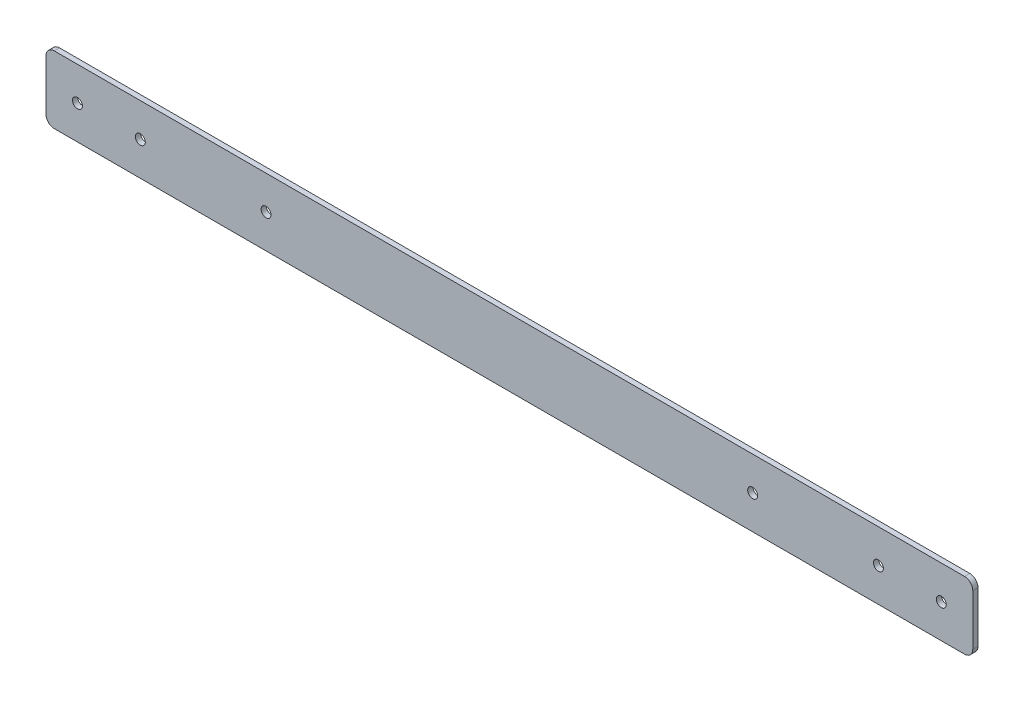
ISO-10303-21;
HEADER;
FILE_DESCRIPTION(('STEP AP214'),'2;1');
FILE_NAME('part.step','',(''),(''),'','','');
FILE_SCHEMA(('AUTOMOTIVE_DESIGN { 1 0 10303 214 1 1 1 1 }'));
ENDSEC;
DATA;
#1=APPLICATION_CONTEXT('core data for automotive mechanical design processes');
#2=APPLICATION_PROTOCOL_DEFINITION('international standard','automotive_design',2000,#1);
#3=PRODUCT_CONTEXT('',#1,'mechanical');
#4=PRODUCT('Part','Part','',(#3));
#5=PRODUCT_RELATED_PRODUCT_CATEGORY('part','',(#4));
#6=PRODUCT_DEFINITION_FORMATION('','',#4);
#7=PRODUCT_DEFINITION_CONTEXT('part definition',#1,'design');
#8=PRODUCT_DEFINITION('design','',#6,#7);
#9=PRODUCT_DEFINITION_SHAPE('','',#8);
#10=(LENGTH_UNIT() NAMED_UNIT(*) SI_UNIT(.MILLI.,.METRE.));
#11=(NAMED_UNIT(*) PLANE_ANGLE_UNIT() SI_UNIT($,.RADIAN.));
#12=(NAMED_UNIT(*) SI_UNIT($,.STERADIAN.) SOLID_ANGLE_UNIT());
#13=UNCERTAINTY_MEASURE_WITH_UNIT(LENGTH_MEASURE(1.E-05),#10,'distance_accuracy_value','');
#14=(GEOMETRIC_REPRESENTATION_CONTEXT(3) GLOBAL_UNCERTAINTY_ASSIGNED_CONTEXT((#13)) GLOBAL_UNIT_ASSIGNED_CONTEXT((#10,
#11,#12)) REPRESENTATION_CONTEXT('',''));
#15=CARTESIAN_POINT('',(0.,0.,0.));
#16=DIRECTION('',(0.,0.,1.));
#17=DIRECTION('',(1.,0.,0.));
#18=AXIS2_PLACEMENT_3D('',#15,#16,#17);
#19=CARTESIAN_POINT('',(1113.,71.6,6.35));
#20=DIRECTION('',(0.,0.,-1.));
#21=DIRECTION('',(-1.,0.,0.));
#22=AXIS2_PLACEMENT_3D('',#19,#20,#21);
#23=PLANE('',#22);
#24=CARTESIAN_POINT('',(1113.,71.6,6.35));
#25=DIRECTION('',(0.,0.,1.));
#26=DIRECTION('',(-1.,0.,0.));
#27=AXIS2_PLACEMENT_3D('',#24,#25,#26);
#28=CIRCLE('',#27,10.);
#29=CARTESIAN_POINT('',(1123.,71.5999999999999,6.35));
#30=VERTEX_POINT('',#29);
#31=CARTESIAN_POINT('',(1113.,81.6,6.35));
#32=VERTEX_POINT('',#31);
#33=EDGE_CURVE('E148',#30,#32,#28,.T.);
#34=ORIENTED_EDGE('',*,*,#33,.T.);
#35=DIRECTION('',(-1.,0.,0.));
#36=VECTOR('',#35,1.);
#37=CARTESIAN_POINT('',(10.0000000000001,81.6,6.35));
#38=LINE('',#37,#36);
#39=CARTESIAN_POINT('',(10.0000000000001,81.6,6.35));
#40=VERTEX_POINT('',#39);
#41=EDGE_CURVE('E96',#32,#40,#38,.T.);
#42=ORIENTED_EDGE('',*,*,#41,.T.);
#43=CARTESIAN_POINT('',(10.,71.6,6.35));
#44=DIRECTION('',(0.,0.,1.));
#45=DIRECTION('',(-1.,0.,0.));
#46=AXIS2_PLACEMENT_3D('',#43,#44,#45);
#47=CIRCLE('',#46,10.);
#48=CARTESIAN_POINT('',(0.,71.5999999999999,6.35));
#49=VERTEX_POINT('',#48);
#50=EDGE_CURVE('E163',#40,#49,#47,.T.);
#51=ORIENTED_EDGE('',*,*,#50,.T.);
#52=DIRECTION('',(0.,-1.,0.));
#53=VECTOR('',#52,1.);
#54=CARTESIAN_POINT('',(0.,10.0000000000001,6.35));
#55=LINE('',#54,#53);
#56=CARTESIAN_POINT('',(0.,10.0000000000001,6.35));
#57=VERTEX_POINT('',#56);
#58=EDGE_CURVE('E176',#49,#57,#55,.T.);
#59=ORIENTED_EDGE('',*,*,#58,.T.);
#60=CARTESIAN_POINT('',(10.,10.,6.35));
#61=DIRECTION('',(0.,0.,1.));
#62=DIRECTION('',(-1.,0.,0.));
#63=AXIS2_PLACEMENT_3D('',#60,#61,#62);
#64=CIRCLE('',#63,10.);
#65=CARTESIAN_POINT('',(10.0000000000001,0.,6.35));
#66=VERTEX_POINT('',#65);
#67=EDGE_CURVE('E115',#57,#66,#64,.T.);
#68=ORIENTED_EDGE('',*,*,#67,.T.);
#69=DIRECTION('',(1.,0.,0.));
#70=VECTOR('',#69,1.);
#71=CARTESIAN_POINT('',(10.0000000000001,0.,6.35));
#72=LINE('',#71,#70);
#73=CARTESIAN_POINT('',(1113.,0.,6.35));
#74=VERTEX_POINT('',#73);
#75=EDGE_CURVE('E109',#66,#74,#72,.T.);
#76=ORIENTED_EDGE('',*,*,#75,.T.);
#77=CARTESIAN_POINT('',(1113.,10.,6.35));
#78=DIRECTION('',(0.,0.,1.));
#79=DIRECTION('',(1.,0.,0.));
#80=AXIS2_PLACEMENT_3D('',#77,#78,#79);
#81=CIRCLE('',#80,10.);
#82=CARTESIAN_POINT('',(1123.,10.,6.35));
#83=VERTEX_POINT('',#82);
#84=EDGE_CURVE('E113',#74,#83,#81,.T.);
#85=ORIENTED_EDGE('',*,*,#84,.T.);
#86=DIRECTION('',(0.,1.,0.));
#87=VECTOR('',#86,1.);
#88=CARTESIAN_POINT('',(1123.,10.0000000000001,6.35));
#89=LINE('',#88,#87);
#90=EDGE_CURVE('E53',#83,#30,#89,.T.);
#91=ORIENTED_EDGE('',*,*,#90,.T.);
#92=EDGE_LOOP('',(#34,#42,#51,#59,#68,#76,#85,#91));
#93=FACE_BOUND('',#92,.T.);
#94=CARTESIAN_POINT('',(38.1,40.8,6.35));
#95=DIRECTION('',(0.,0.,1.));
#96=DIRECTION('',(1.,0.,0.));
#97=AXIS2_PLACEMENT_3D('',#94,#95,#96);
#98=CIRCLE('',#97,5.99999999999999);
#99=CARTESIAN_POINT('',(44.1,40.8,6.35));
#100=VERTEX_POINT('',#99);
#101=EDGE_CURVE('E137',#100,#100,#98,.T.);
#102=ORIENTED_EDGE('',*,*,#101,.F.);
#103=EDGE_LOOP('',(#102));
#104=FACE_BOUND('',#103,.T.);
#105=CARTESIAN_POINT('',(114.3,40.8,6.35));
#106=DIRECTION('',(0.,0.,1.));
#107=DIRECTION('',(1.,0.,0.));
#108=AXIS2_PLACEMENT_3D('',#105,#106,#107);
#109=CIRCLE('',#108,6.);
#110=CARTESIAN_POINT('',(120.3,40.8,6.35));
#111=VERTEX_POINT('',#110);
#112=EDGE_CURVE('E185',#111,#111,#109,.T.);
#113=ORIENTED_EDGE('',*,*,#112,.F.);
#114=EDGE_LOOP('',(#113));
#115=FACE_BOUND('',#114,.T.);
#116=CARTESIAN_POINT('',(266.7,40.8,6.35));
#117=DIRECTION('',(0.,0.,1.));
#118=DIRECTION('',(1.,0.,0.));
#119=AXIS2_PLACEMENT_3D('',#116,#117,#118);
#120=CIRCLE('',#119,5.99999999999999);
#121=CARTESIAN_POINT('',(272.7,40.8,6.35));
#122=VERTEX_POINT('',#121);
#123=EDGE_CURVE('E191',#122,#122,#120,.T.);
#124=ORIENTED_EDGE('',*,*,#123,.F.);
#125=EDGE_LOOP('',(#124));
#126=FACE_BOUND('',#125,.T.);
#127=CARTESIAN_POINT('',(856.3,40.8,6.35));
#128=DIRECTION('',(0.,0.,1.));
#129=DIRECTION('',(-1.,0.,0.));
#130=AXIS2_PLACEMENT_3D('',#127,#128,#129);
#131=CIRCLE('',#130,6.0000000000001);
#132=CARTESIAN_POINT('',(850.3,40.8,6.35));
#133=VERTEX_POINT('',#132);
#134=EDGE_CURVE('E197',#133,#133,#131,.T.);
#135=ORIENTED_EDGE('',*,*,#134,.F.);
#136=EDGE_LOOP('',(#135));
#137=FACE_BOUND('',#136,.T.);
#138=CARTESIAN_POINT('',(1008.7,40.8,6.35));
#139=DIRECTION('',(0.,0.,1.));
#140=DIRECTION('',(-1.,0.,0.));
#141=AXIS2_PLACEMENT_3D('',#138,#139,#140);
#142=CIRCLE('',#141,5.99999999999988);
#143=CARTESIAN_POINT('',(1002.7,40.8,6.35));
#144=VERTEX_POINT('',#143);
#145=EDGE_CURVE('E203',#144,#144,#142,.T.);
#146=ORIENTED_EDGE('',*,*,#145,.F.);
#147=EDGE_LOOP('',(#146));
#148=FACE_BOUND('',#147,.T.);
#149=CARTESIAN_POINT('',(1084.9,40.8,6.35));
#150=DIRECTION('',(0.,0.,1.));
#151=DIRECTION('',(-1.,0.,0.));
#152=AXIS2_PLACEMENT_3D('',#149,#150,#151);
#153=CIRCLE('',#152,6.0000000000001);
#154=CARTESIAN_POINT('',(1078.9,40.8,6.35));
#155=VERTEX_POINT('',#154);
#156=EDGE_CURVE('E209',#155,#155,#153,.T.);
#157=ORIENTED_EDGE('',*,*,#156,.F.);
#158=EDGE_LOOP('',(#157));
#159=FACE_BOUND('',#158,.T.);
#160=ADVANCED_FACE('F36',(#93,#104,#115,#126,#137,#148,#159),#23,.F.);
#161=CARTESIAN_POINT('',(1113.,71.6,0.));
#162=DIRECTION('',(0.,0.,-1.));
#163=DIRECTION('',(-1.,0.,0.));
#164=AXIS2_PLACEMENT_3D('',#161,#162,#163);
#165=PLANE('',#164);
#166=CARTESIAN_POINT('',(1008.7,40.8,0.));
#167=DIRECTION('',(0.,0.,1.));
#168=DIRECTION('',(-1.,0.,0.));
#169=AXIS2_PLACEMENT_3D('',#166,#167,#168);
#170=CIRCLE('',#169,5.99999999999988);
#171=CARTESIAN_POINT('',(1002.7,40.8,0.));
#172=VERTEX_POINT('',#171);
#173=EDGE_CURVE('E206',#172,#172,#170,.T.);
#174=ORIENTED_EDGE('',*,*,#173,.T.);
#175=EDGE_LOOP('',(#174));
#176=FACE_BOUND('',#175,.T.);
#177=CARTESIAN_POINT('',(266.7,40.8,0.));
#178=DIRECTION('',(0.,0.,1.));
#179=DIRECTION('',(1.,0.,0.));
#180=AXIS2_PLACEMENT_3D('',#177,#178,#179);
#181=CIRCLE('',#180,5.99999999999999);
#182=CARTESIAN_POINT('',(272.7,40.8,0.));
#183=VERTEX_POINT('',#182);
#184=EDGE_CURVE('E194',#183,#183,#181,.T.);
#185=ORIENTED_EDGE('',*,*,#184,.T.);
#186=EDGE_LOOP('',(#185));
#187=FACE_BOUND('',#186,.T.);
#188=CARTESIAN_POINT('',(38.1,40.8,0.));
#189=DIRECTION('',(0.,0.,1.));
#190=DIRECTION('',(1.,0.,0.));
#191=AXIS2_PLACEMENT_3D('',#188,#189,#190);
#192=CIRCLE('',#191,5.99999999999999);
#193=CARTESIAN_POINT('',(44.1,40.8,0.));
#194=VERTEX_POINT('',#193);
#195=EDGE_CURVE('E182',#194,#194,#192,.T.);
#196=ORIENTED_EDGE('',*,*,#195,.T.);
#197=EDGE_LOOP('',(#196));
#198=FACE_BOUND('',#197,.T.);
#199=CARTESIAN_POINT('',(1113.,71.6,0.));
#200=DIRECTION('',(0.,0.,1.));
#201=DIRECTION('',(-1.,0.,0.));
#202=AXIS2_PLACEMENT_3D('',#199,#200,#201);
#203=CIRCLE('',#202,10.);
#204=CARTESIAN_POINT('',(1123.,71.5999999999999,0.));
#205=VERTEX_POINT('',#204);
#206=CARTESIAN_POINT('',(1113.,81.6,0.));
#207=VERTEX_POINT('',#206);
#208=EDGE_CURVE('E133',#205,#207,#203,.T.);
#209=ORIENTED_EDGE('',*,*,#208,.F.);
#210=DIRECTION('',(0.,1.,0.));
#211=VECTOR('',#210,1.);
#212=CARTESIAN_POINT('',(1123.,10.0000000000001,0.));
#213=LINE('',#212,#211);
#214=CARTESIAN_POINT('',(1123.,10.,0.));
#215=VERTEX_POINT('',#214);
#216=EDGE_CURVE('E88',#215,#205,#213,.T.);
#217=ORIENTED_EDGE('',*,*,#216,.F.);
#218=CARTESIAN_POINT('',(1113.,10.,0.));
#219=DIRECTION('',(0.,0.,1.));
#220=DIRECTION('',(1.,0.,0.));
#221=AXIS2_PLACEMENT_3D('',#218,#219,#220);
#222=CIRCLE('',#221,10.);
#223=CARTESIAN_POINT('',(1113.,0.,0.));
#224=VERTEX_POINT('',#223);
#225=EDGE_CURVE('E82',#224,#215,#222,.T.);
#226=ORIENTED_EDGE('',*,*,#225,.F.);
#227=DIRECTION('',(1.,0.,0.));
#228=VECTOR('',#227,1.);
#229=CARTESIAN_POINT('',(10.0000000000001,0.,0.));
#230=LINE('',#229,#228);
#231=CARTESIAN_POINT('',(10.0000000000001,0.,0.));
#232=VERTEX_POINT('',#231);
#233=EDGE_CURVE('E123',#232,#224,#230,.T.);
#234=ORIENTED_EDGE('',*,*,#233,.F.);
#235=CARTESIAN_POINT('',(10.,10.,0.));
#236=DIRECTION('',(0.,0.,1.));
#237=DIRECTION('',(-1.,0.,0.));
#238=AXIS2_PLACEMENT_3D('',#235,#236,#237);
#239=CIRCLE('',#238,10.);
#240=CARTESIAN_POINT('',(0.,10.0000000000001,0.));
#241=VERTEX_POINT('',#240);
#242=EDGE_CURVE('E143',#241,#232,#239,.T.);
#243=ORIENTED_EDGE('',*,*,#242,.F.);
#244=DIRECTION('',(0.,-1.,0.));
#245=VECTOR('',#244,1.);
#246=CARTESIAN_POINT('',(0.,10.0000000000001,0.));
#247=LINE('',#246,#245);
#248=CARTESIAN_POINT('',(0.,71.5999999999999,0.));
#249=VERTEX_POINT('',#248);
#250=EDGE_CURVE('E141',#249,#241,#247,.T.);
#251=ORIENTED_EDGE('',*,*,#250,.F.);
#252=CARTESIAN_POINT('',(10.,71.6,0.));
#253=DIRECTION('',(0.,0.,1.));
#254=DIRECTION('',(-1.,0.,0.));
#255=AXIS2_PLACEMENT_3D('',#252,#253,#254);
#256=CIRCLE('',#255,10.);
#257=CARTESIAN_POINT('',(10.0000000000001,81.6,0.));
#258=VERTEX_POINT('',#257);
#259=EDGE_CURVE('E139',#258,#249,#256,.T.);
#260=ORIENTED_EDGE('',*,*,#259,.F.);
#261=DIRECTION('',(-1.,0.,0.));
#262=VECTOR('',#261,1.);
#263=CARTESIAN_POINT('',(10.0000000000001,81.6,0.));
#264=LINE('',#263,#262);
#265=EDGE_CURVE('E136',#207,#258,#264,.T.);
#266=ORIENTED_EDGE('',*,*,#265,.F.);
#267=EDGE_LOOP('',(#209,#217,#226,#234,#243,#251,#260,#266));
#268=FACE_BOUND('',#267,.T.);
#269=CARTESIAN_POINT('',(114.3,40.8,0.));
#270=DIRECTION('',(0.,0.,1.));
#271=DIRECTION('',(1.,0.,0.));
#272=AXIS2_PLACEMENT_3D('',#269,#270,#271);
#273=CIRCLE('',#272,6.);
#274=CARTESIAN_POINT('',(120.3,40.8,0.));
#275=VERTEX_POINT('',#274);
#276=EDGE_CURVE('E188',#275,#275,#273,.T.);
#277=ORIENTED_EDGE('',*,*,#276,.T.);
#278=EDGE_LOOP('',(#277));
#279=FACE_BOUND('',#278,.T.);
#280=CARTESIAN_POINT('',(856.3,40.8,0.));
#281=DIRECTION('',(0.,0.,1.));
#282=DIRECTION('',(-1.,0.,0.));
#283=AXIS2_PLACEMENT_3D('',#280,#281,#282);
#284=CIRCLE('',#283,6.0000000000001);
#285=CARTESIAN_POINT('',(850.3,40.8,0.));
#286=VERTEX_POINT('',#285);
#287=EDGE_CURVE('E200',#286,#286,#284,.T.);
#288=ORIENTED_EDGE('',*,*,#287,.T.);
#289=EDGE_LOOP('',(#288));
#290=FACE_BOUND('',#289,.T.);
#291=CARTESIAN_POINT('',(1084.9,40.8,0.));
#292=DIRECTION('',(0.,0.,1.));
#293=DIRECTION('',(-1.,0.,0.));
#294=AXIS2_PLACEMENT_3D('',#291,#292,#293);
#295=CIRCLE('',#294,6.0000000000001);
#296=CARTESIAN_POINT('',(1078.9,40.8,0.));
#297=VERTEX_POINT('',#296);
#298=EDGE_CURVE('E212',#297,#297,#295,.T.);
#299=ORIENTED_EDGE('',*,*,#298,.T.);
#300=EDGE_LOOP('',(#299));
#301=FACE_BOUND('',#300,.T.);
#302=ADVANCED_FACE('F167',(#176,#187,#198,#268,#279,#290,#301),#165,.T.);
#303=CARTESIAN_POINT('',(1113.,71.6,6.35));
#304=DIRECTION('',(0.,0.,-1.));
#305=DIRECTION('',(-1.,0.,0.));
#306=AXIS2_PLACEMENT_3D('',#303,#304,#305);
#307=CYLINDRICAL_SURFACE('',#306,10.);
#308=ORIENTED_EDGE('',*,*,#208,.T.);
#309=DIRECTION('',(0.,0.,-1.));
#310=VECTOR('',#309,1.);
#311=CARTESIAN_POINT('',(1113.,81.6,6.35));
#312=LINE('',#311,#310);
#313=EDGE_CURVE('E11',#32,#207,#312,.T.);
#314=ORIENTED_EDGE('',*,*,#313,.F.);
#315=ORIENTED_EDGE('',*,*,#33,.F.);
#316=DIRECTION('',(0.,0.,-1.));
#317=VECTOR('',#316,1.);
#318=CARTESIAN_POINT('',(1123.,71.5999999999999,6.35));
#319=LINE('',#318,#317);
#320=EDGE_CURVE('E129',#30,#205,#319,.T.);
#321=ORIENTED_EDGE('',*,*,#320,.T.);
#322=EDGE_LOOP('',(#308,#314,#315,#321));
#323=FACE_BOUND('',#322,.T.);
#324=ADVANCED_FACE('F38',(#323),#307,.T.);
#325=CARTESIAN_POINT('',(10.0000000000001,81.6,6.35));
#326=DIRECTION('',(0.,-1.,0.));
#327=DIRECTION('',(0.,0.,-1.));
#328=AXIS2_PLACEMENT_3D('',#325,#326,#327);
#329=PLANE('',#328);
#330=ORIENTED_EDGE('',*,*,#265,.T.);
#331=DIRECTION('',(0.,0.,-1.));
#332=VECTOR('',#331,1.);
#333=CARTESIAN_POINT('',(10.0000000000001,81.6,6.35));
#334=LINE('',#333,#332);
#335=EDGE_CURVE('E45',#40,#258,#334,.T.);
#336=ORIENTED_EDGE('',*,*,#335,.F.);
#337=ORIENTED_EDGE('',*,*,#41,.F.);
#338=ORIENTED_EDGE('',*,*,#313,.T.);
#339=EDGE_LOOP('',(#330,#336,#337,#338));
#340=FACE_BOUND('',#339,.T.);
#341=ADVANCED_FACE('F244',(#340),#329,.F.);
#342=CARTESIAN_POINT('',(10.,71.6,6.35));
#343=DIRECTION('',(0.,0.,-1.));
#344=DIRECTION('',(-1.,0.,0.));
#345=AXIS2_PLACEMENT_3D('',#342,#343,#344);
#346=CYLINDRICAL_SURFACE('',#345,10.);
#347=ORIENTED_EDGE('',*,*,#259,.T.);
#348=DIRECTION('',(0.,0.,-1.));
#349=VECTOR('',#348,1.);
#350=CARTESIAN_POINT('',(0.,71.5999999999999,6.35));
#351=LINE('',#350,#349);
#352=EDGE_CURVE('E155',#49,#249,#351,.T.);
#353=ORIENTED_EDGE('',*,*,#352,.F.);
#354=ORIENTED_EDGE('',*,*,#50,.F.);
#355=ORIENTED_EDGE('',*,*,#335,.T.);
#356=EDGE_LOOP('',(#347,#353,#354,#355));
#357=FACE_BOUND('',#356,.T.);
#358=ADVANCED_FACE('F161',(#357),#346,.T.);
#359=CARTESIAN_POINT('',(0.,10.0000000000001,6.35));
#360=DIRECTION('',(1.,0.,0.));
#361=DIRECTION('',(0.,0.,-1.));
#362=AXIS2_PLACEMENT_3D('',#359,#360,#361);
#363=PLANE('',#362);
#364=ORIENTED_EDGE('',*,*,#250,.T.);
#365=DIRECTION('',(0.,0.,-1.));
#366=VECTOR('',#365,1.);
#367=CARTESIAN_POINT('',(0.,10.0000000000001,6.35));
#368=LINE('',#367,#366);
#369=EDGE_CURVE('E152',#57,#241,#368,.T.);
#370=ORIENTED_EDGE('',*,*,#369,.F.);
#371=ORIENTED_EDGE('',*,*,#58,.F.);
#372=ORIENTED_EDGE('',*,*,#352,.T.);
#373=EDGE_LOOP('',(#364,#370,#371,#372));
#374=FACE_BOUND('',#373,.T.);
#375=ADVANCED_FACE('F172',(#374),#363,.F.);
#376=CARTESIAN_POINT('',(10.,10.,6.35));
#377=DIRECTION('',(0.,0.,-1.));
#378=DIRECTION('',(-1.,0.,0.));
#379=AXIS2_PLACEMENT_3D('',#376,#377,#378);
#380=CYLINDRICAL_SURFACE('',#379,10.);
#381=ORIENTED_EDGE('',*,*,#242,.T.);
#382=DIRECTION('',(0.,0.,-1.));
#383=VECTOR('',#382,1.);
#384=CARTESIAN_POINT('',(10.0000000000001,0.,6.35));
#385=LINE('',#384,#383);
#386=EDGE_CURVE('E124',#66,#232,#385,.T.);
#387=ORIENTED_EDGE('',*,*,#386,.F.);
#388=ORIENTED_EDGE('',*,*,#67,.F.);
#389=ORIENTED_EDGE('',*,*,#369,.T.);
#390=EDGE_LOOP('',(#381,#387,#388,#389));
#391=FACE_BOUND('',#390,.T.);
#392=ADVANCED_FACE('F175',(#391),#380,.T.);
#393=CARTESIAN_POINT('',(10.0000000000001,0.,6.35));
#394=DIRECTION('',(0.,1.,0.));
#395=DIRECTION('',(0.,0.,1.));
#396=AXIS2_PLACEMENT_3D('',#393,#394,#395);
#397=PLANE('',#396);
#398=ORIENTED_EDGE('',*,*,#233,.T.);
#399=DIRECTION('',(0.,0.,-1.));
#400=VECTOR('',#399,1.);
#401=CARTESIAN_POINT('',(1113.,0.,6.35));
#402=LINE('',#401,#400);
#403=EDGE_CURVE('E120',#74,#224,#402,.T.);
#404=ORIENTED_EDGE('',*,*,#403,.F.);
#405=ORIENTED_EDGE('',*,*,#75,.F.);
#406=ORIENTED_EDGE('',*,*,#386,.T.);
#407=EDGE_LOOP('',(#398,#404,#405,#406));
#408=FACE_BOUND('',#407,.T.);
#409=ADVANCED_FACE('F121',(#408),#397,.F.);
#410=CARTESIAN_POINT('',(1113.,10.,6.35));
#411=DIRECTION('',(0.,0.,-1.));
#412=DIRECTION('',(-1.,0.,0.));
#413=AXIS2_PLACEMENT_3D('',#410,#411,#412);
#414=CYLINDRICAL_SURFACE('',#413,10.);
#415=ORIENTED_EDGE('',*,*,#225,.T.);
#416=DIRECTION('',(0.,0.,-1.));
#417=VECTOR('',#416,1.);
#418=CARTESIAN_POINT('',(1123.,10.,6.35));
#419=LINE('',#418,#417);
#420=EDGE_CURVE('E125',#83,#215,#419,.T.);
#421=ORIENTED_EDGE('',*,*,#420,.F.);
#422=ORIENTED_EDGE('',*,*,#84,.F.);
#423=ORIENTED_EDGE('',*,*,#403,.T.);
#424=EDGE_LOOP('',(#415,#421,#422,#423));
#425=FACE_BOUND('',#424,.T.);
#426=ADVANCED_FACE('F127',(#425),#414,.T.);
#427=CARTESIAN_POINT('',(1123.,10.0000000000001,6.35));
#428=DIRECTION('',(-1.,0.,0.));
#429=DIRECTION('',(0.,0.,1.));
#430=AXIS2_PLACEMENT_3D('',#427,#428,#429);
#431=PLANE('',#430);
#432=ORIENTED_EDGE('',*,*,#216,.T.);
#433=ORIENTED_EDGE('',*,*,#320,.F.);
#434=ORIENTED_EDGE('',*,*,#90,.F.);
#435=ORIENTED_EDGE('',*,*,#420,.T.);
#436=EDGE_LOOP('',(#432,#433,#434,#435));
#437=FACE_BOUND('',#436,.T.);
#438=ADVANCED_FACE('F232',(#437),#431,.F.);
#439=CARTESIAN_POINT('',(38.1,40.8,6.35));
#440=DIRECTION('',(0.,0.,-1.));
#441=DIRECTION('',(-1.,0.,0.));
#442=AXIS2_PLACEMENT_3D('',#439,#440,#441);
#443=CYLINDRICAL_SURFACE('',#442,5.99999999999999);
#444=ORIENTED_EDGE('',*,*,#101,.T.);
#445=EDGE_LOOP('',(#444));
#446=FACE_BOUND('',#445,.T.);
#447=ORIENTED_EDGE('',*,*,#195,.F.);
#448=EDGE_LOOP('',(#447));
#449=FACE_BOUND('',#448,.T.);
#450=ADVANCED_FACE('F229',(#446,#449),#443,.F.);
#451=CARTESIAN_POINT('',(114.3,40.8,6.35));
#452=DIRECTION('',(0.,0.,-1.));
#453=DIRECTION('',(-1.,0.,0.));
#454=AXIS2_PLACEMENT_3D('',#451,#452,#453);
#455=CYLINDRICAL_SURFACE('',#454,6.);
#456=ORIENTED_EDGE('',*,*,#112,.T.);
#457=EDGE_LOOP('',(#456));
#458=FACE_BOUND('',#457,.T.);
#459=ORIENTED_EDGE('',*,*,#276,.F.);
#460=EDGE_LOOP('',(#459));
#461=FACE_BOUND('',#460,.T.);
#462=ADVANCED_FACE('F308',(#458,#461),#455,.F.);
#463=CARTESIAN_POINT('',(266.7,40.8,6.35));
#464=DIRECTION('',(0.,0.,-1.));
#465=DIRECTION('',(-1.,0.,0.));
#466=AXIS2_PLACEMENT_3D('',#463,#464,#465);
#467=CYLINDRICAL_SURFACE('',#466,5.99999999999999);
#468=ORIENTED_EDGE('',*,*,#123,.T.);
#469=EDGE_LOOP('',(#468));
#470=FACE_BOUND('',#469,.T.);
#471=ORIENTED_EDGE('',*,*,#184,.F.);
#472=EDGE_LOOP('',(#471));
#473=FACE_BOUND('',#472,.T.);
#474=ADVANCED_FACE('F316',(#470,#473),#467,.F.);
#475=CARTESIAN_POINT('',(856.3,40.8,6.35));
#476=DIRECTION('',(0.,0.,-1.));
#477=DIRECTION('',(-1.,0.,0.));
#478=AXIS2_PLACEMENT_3D('',#475,#476,#477);
#479=CYLINDRICAL_SURFACE('',#478,6.0000000000001);
#480=ORIENTED_EDGE('',*,*,#134,.T.);
#481=EDGE_LOOP('',(#480));
#482=FACE_BOUND('',#481,.T.);
#483=ORIENTED_EDGE('',*,*,#287,.F.);
#484=EDGE_LOOP('',(#483));
#485=FACE_BOUND('',#484,.T.);
#486=ADVANCED_FACE('F324',(#482,#485),#479,.F.);
#487=CARTESIAN_POINT('',(1008.7,40.8,6.35));
#488=DIRECTION('',(0.,0.,-1.));
#489=DIRECTION('',(-1.,0.,0.));
#490=AXIS2_PLACEMENT_3D('',#487,#488,#489);
#491=CYLINDRICAL_SURFACE('',#490,5.99999999999988);
#492=ORIENTED_EDGE('',*,*,#145,.T.);
#493=EDGE_LOOP('',(#492));
#494=FACE_BOUND('',#493,.T.);
#495=ORIENTED_EDGE('',*,*,#173,.F.);
#496=EDGE_LOOP('',(#495));
#497=FACE_BOUND('',#496,.T.);
#498=ADVANCED_FACE('F333',(#494,#497),#491,.F.);
#499=CARTESIAN_POINT('',(1084.9,40.8,6.35));
#500=DIRECTION('',(0.,0.,-1.));
#501=DIRECTION('',(-1.,0.,0.));
#502=AXIS2_PLACEMENT_3D('',#499,#500,#501);
#503=CYLINDRICAL_SURFACE('',#502,6.0000000000001);
#504=ORIENTED_EDGE('',*,*,#156,.T.);
#505=EDGE_LOOP('',(#504));
#506=FACE_BOUND('',#505,.T.);
#507=ORIENTED_EDGE('',*,*,#298,.F.);
#508=EDGE_LOOP('',(#507));
#509=FACE_BOUND('',#508,.T.);
#510=ADVANCED_FACE('F218',(#506,#509),#503,.F.);
#511=CLOSED_SHELL('',(#160,#302,#324,#341,#358,#375,#392,#409,#426,#438,#450,#462,#474,#486,
#498,#510));
#512=MANIFOLD_SOLID_BREP('B2',#511);
#513=ADVANCED_BREP_SHAPE_REPRESENTATION('',(#18,#512),#14);
#514=SHAPE_DEFINITION_REPRESENTATION(#9,#513);
ENDSEC;
END-ISO-10303-21;
